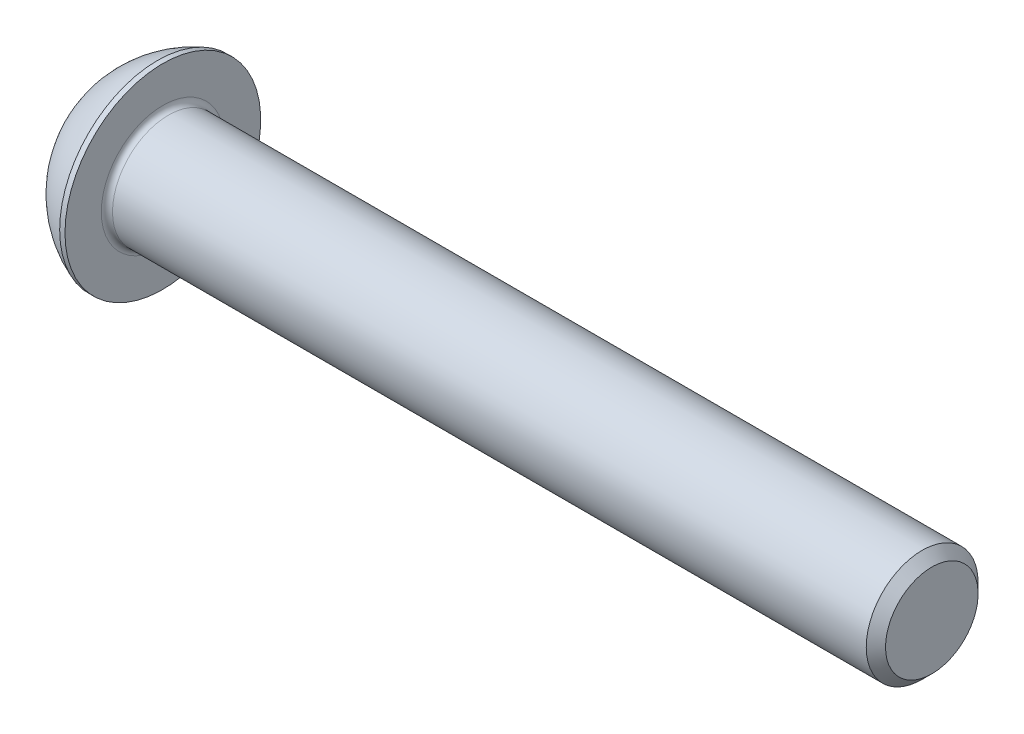
ISO-10303-21;
HEADER;
FILE_DESCRIPTION(('STEP AP214'),'2;1');
FILE_NAME('part.step','',(''),(''),'','','');
FILE_SCHEMA(('AUTOMOTIVE_DESIGN { 1 0 10303 214 1 1 1 1 }'));
ENDSEC;
DATA;
#1=APPLICATION_CONTEXT('core data for automotive mechanical design processes');
#2=APPLICATION_PROTOCOL_DEFINITION('international standard','automotive_design',2000,#1);
#3=PRODUCT_CONTEXT('',#1,'mechanical');
#4=PRODUCT('Part','Part','',(#3));
#5=PRODUCT_RELATED_PRODUCT_CATEGORY('part','',(#4));
#6=PRODUCT_DEFINITION_FORMATION('','',#4);
#7=PRODUCT_DEFINITION_CONTEXT('part definition',#1,'design');
#8=PRODUCT_DEFINITION('design','',#6,#7);
#9=PRODUCT_DEFINITION_SHAPE('','',#8);
#10=(LENGTH_UNIT() NAMED_UNIT(*) SI_UNIT(.MILLI.,.METRE.));
#11=(NAMED_UNIT(*) PLANE_ANGLE_UNIT() SI_UNIT($,.RADIAN.));
#12=(NAMED_UNIT(*) SI_UNIT($,.STERADIAN.) SOLID_ANGLE_UNIT());
#13=UNCERTAINTY_MEASURE_WITH_UNIT(LENGTH_MEASURE(1.E-05),#10,'distance_accuracy_value','');
#14=(GEOMETRIC_REPRESENTATION_CONTEXT(3) GLOBAL_UNCERTAINTY_ASSIGNED_CONTEXT((#13)) GLOBAL_UNIT_ASSIGNED_CONTEXT((#10,
#11,#12)) REPRESENTATION_CONTEXT('',''));
#15=CARTESIAN_POINT('',(0.,0.,0.));
#16=DIRECTION('',(0.,0.,1.));
#17=DIRECTION('',(1.,0.,0.));
#18=AXIS2_PLACEMENT_3D('',#15,#16,#17);
#19=CARTESIAN_POINT('',(0.,0.,0.));
#20=DIRECTION('',(-1.,0.,0.));
#21=DIRECTION('',(0.,0.,1.));
#22=AXIS2_PLACEMENT_3D('',#19,#20,#21);
#23=PLANE('',#22);
#24=CARTESIAN_POINT('',(0.,0.,0.));
#25=DIRECTION('',(-1.,0.,0.));
#26=DIRECTION('',(0.,0.,1.));
#27=AXIS2_PLACEMENT_3D('',#24,#25,#26);
#28=CIRCLE('',#27,3.5);
#29=CARTESIAN_POINT('',(0.,3.5,0.));
#30=VERTEX_POINT('',#29);
#31=EDGE_CURVE('E161',#30,#30,#28,.T.);
#32=ORIENTED_EDGE('',*,*,#31,.T.);
#33=EDGE_LOOP('',(#32));
#34=FACE_BOUND('',#33,.T.);
#35=DIRECTION('',(0.,-1.,0.));
#36=VECTOR('',#35,1.);
#37=CARTESIAN_POINT('',(0.,-1.44337567297406,2.5));
#38=LINE('',#37,#36);
#39=CARTESIAN_POINT('',(0.,1.44337567297406,2.5));
#40=VERTEX_POINT('',#39);
#41=CARTESIAN_POINT('',(0.,-1.44337567297406,2.5));
#42=VERTEX_POINT('',#41);
#43=EDGE_CURVE('E51',#40,#42,#38,.T.);
#44=ORIENTED_EDGE('',*,*,#43,.T.);
#45=DIRECTION('',(0.,-0.5,-0.866025403784439));
#46=VECTOR('',#45,1.);
#47=CARTESIAN_POINT('',(0.,-2.88675134594813,0.));
#48=LINE('',#47,#46);
#49=CARTESIAN_POINT('',(0.,-2.88675134594813,0.));
#50=VERTEX_POINT('',#49);
#51=EDGE_CURVE('E254',#42,#50,#48,.T.);
#52=ORIENTED_EDGE('',*,*,#51,.T.);
#53=DIRECTION('',(0.,0.5,-0.866025403784439));
#54=VECTOR('',#53,1.);
#55=CARTESIAN_POINT('',(0.,-1.44337567297406,-2.5));
#56=LINE('',#55,#54);
#57=CARTESIAN_POINT('',(0.,-1.44337567297406,-2.5));
#58=VERTEX_POINT('',#57);
#59=EDGE_CURVE('E136',#50,#58,#56,.T.);
#60=ORIENTED_EDGE('',*,*,#59,.T.);
#61=DIRECTION('',(0.,1.,0.));
#62=VECTOR('',#61,1.);
#63=CARTESIAN_POINT('',(0.,1.44337567297406,-2.5));
#64=LINE('',#63,#62);
#65=CARTESIAN_POINT('',(0.,1.44337567297406,-2.5));
#66=VERTEX_POINT('',#65);
#67=EDGE_CURVE('E257',#58,#66,#64,.T.);
#68=ORIENTED_EDGE('',*,*,#67,.T.);
#69=DIRECTION('',(0.,0.5,0.866025403784439));
#70=VECTOR('',#69,1.);
#71=CARTESIAN_POINT('',(0.,2.88675134594813,0.));
#72=LINE('',#71,#70);
#73=CARTESIAN_POINT('',(0.,2.88675134594813,0.));
#74=VERTEX_POINT('',#73);
#75=EDGE_CURVE('E259',#66,#74,#72,.T.);
#76=ORIENTED_EDGE('',*,*,#75,.T.);
#77=DIRECTION('',(0.,-0.5,0.866025403784439));
#78=VECTOR('',#77,1.);
#79=CARTESIAN_POINT('',(0.,1.44337567297406,2.5));
#80=LINE('',#79,#78);
#81=EDGE_CURVE('E261',#74,#40,#80,.T.);
#82=ORIENTED_EDGE('',*,*,#81,.T.);
#83=EDGE_LOOP('',(#44,#52,#60,#68,#76,#82));
#84=FACE_BOUND('',#83,.T.);
#85=ADVANCED_FACE('F36',(#34,#84),#23,.T.);
#86=CARTESIAN_POINT('',(6.58089552238806,0.,0.));
#87=DIRECTION('',(-1.,0.,0.));
#88=DIRECTION('',(0.,1.,0.));
#89=AXIS2_PLACEMENT_3D('',#86,#87,#88);
#90=SPHERICAL_SURFACE('',#89,7.45373637020972);
#91=CARTESIAN_POINT('',(4.02,0.,0.));
#92=DIRECTION('',(-1.,0.,0.));
#93=DIRECTION('',(0.,0.,1.));
#94=AXIS2_PLACEMENT_3D('',#91,#92,#93);
#95=CIRCLE('',#94,7.);
#96=CARTESIAN_POINT('',(4.02,7.,0.));
#97=VERTEX_POINT('',#96);
#98=EDGE_CURVE('E158',#97,#97,#95,.T.);
#99=CARTESIAN_POINT('',(4.02,7.,0.));
#100=CARTESIAN_POINT('',(3.96667727076465,6.98049242402172,0.));
#101=CARTESIAN_POINT('',(3.913577528648,6.96037534487455,0.));
#102=CARTESIAN_POINT('',(3.8078515532553,6.91893318326458,0.));
#103=CARTESIAN_POINT('',(3.75522531997925,6.89760810080177,0.));
#104=CARTESIAN_POINT('',(3.65047389687093,6.85376093558268,0.));
#105=CARTESIAN_POINT('',(3.59834870703866,6.83123885282639,0.));
#106=CARTESIAN_POINT('',(3.49462657751034,6.7850094841704,0.));
#107=CARTESIAN_POINT('',(3.44302963781429,6.7613021982707,0.));
#108=CARTESIAN_POINT('',(3.34039095714278,6.71271479411965,0.));
#109=CARTESIAN_POINT('',(3.28934921616733,6.6878346758683,0.));
#110=CARTESIAN_POINT('',(3.18784758682982,6.63691460241549,0.));
#111=CARTESIAN_POINT('',(3.13738769846775,6.61087464721403,0.));
#112=CARTESIAN_POINT('',(3.03707612567073,6.55764849769805,0.));
#113=CARTESIAN_POINT('',(2.98722444123577,6.53046230338352,0.));
#114=CARTESIAN_POINT('',(2.88815530965033,6.47495787293607,0.));
#115=CARTESIAN_POINT('',(2.83893786249984,6.44663963680314,0.));
#116=CARTESIAN_POINT('',(2.74116290772229,6.38888591095228,0.));
#117=CARTESIAN_POINT('',(2.69260540009523,6.35945042123436,0.));
#118=CARTESIAN_POINT('',(2.59617568194692,6.29947755995901,0.));
#119=CARTESIAN_POINT('',(2.54830347142567,6.2689401884016,0.));
#120=CARTESIAN_POINT('',(2.45326934720369,6.20677951059818,0.));
#121=CARTESIAN_POINT('',(2.40610743350296,6.17515620435217,0.));
#122=CARTESIAN_POINT('',(2.31251853170541,6.1108401714212,0.));
#123=CARTESIAN_POINT('',(2.2660915436086,6.07814744473625,0.));
#124=CARTESIAN_POINT('',(2.17399673801164,6.01170964364606,0.));
#125=CARTESIAN_POINT('',(2.12832892051151,5.97796456924083,0.));
#126=CARTESIAN_POINT('',(2.03777630464825,5.90943969498364,0.));
#127=CARTESIAN_POINT('',(1.99289150628513,5.87465989513168,0.));
#128=CARTESIAN_POINT('',(1.90392836832988,5.80408373260638,0.));
#129=CARTESIAN_POINT('',(1.85985002873775,5.76828736993305,0.));
#130=CARTESIAN_POINT('',(1.77252282681141,5.69569677525744,0.));
#131=CARTESIAN_POINT('',(1.72927396447721,5.65890254325517,0.));
#132=CARTESIAN_POINT('',(1.64362830238602,5.58433542451906,0.));
#133=CARTESIAN_POINT('',(1.60123150262904,5.54656253778523,0.));
#134=CARTESIAN_POINT('',(1.51731210604947,5.4700578352542,0.));
#135=CARTESIAN_POINT('',(1.47578950922687,5.431326019457,0.));
#136=CARTESIAN_POINT('',(1.39364020234904,5.35292368523707,0.));
#137=CARTESIAN_POINT('',(1.35301349229381,5.31325316681434,0.));
#138=CARTESIAN_POINT('',(1.27267717493576,5.23299414398831,0.));
#139=CARTESIAN_POINT('',(1.23296756763295,5.19240563958501,0.));
#140=CARTESIAN_POINT('',(1.15448619283766,5.1103318408312,0.));
#141=CARTESIAN_POINT('',(1.11571442534517,5.0688465464807,0.));
#142=CARTESIAN_POINT('',(1.03912897747163,4.98500083218559,0.));
#143=CARTESIAN_POINT('',(1.00131529709057,4.94264041224098,0.));
#144=CARTESIAN_POINT('',(0.926665770412102,4.85706656811615,0.));
#145=CARTESIAN_POINT('',(0.889829924114693,4.81385314393593,0.));
#146=CARTESIAN_POINT('',(0.817155301929323,4.72659585815459,0.));
#147=CARTESIAN_POINT('',(0.781316526041361,4.68255199655347,0.));
#148=CARTESIAN_POINT('',(0.710654760328621,4.59365683640532,0.));
#149=CARTESIAN_POINT('',(0.675831770503841,4.54880553785828,0.));
#150=CARTESIAN_POINT('',(0.607219762051194,4.45831892598402,0.));
#151=CARTESIAN_POINT('',(0.573430743423327,4.41268361265678,0.));
#152=CARTESIAN_POINT('',(0.506904322758881,4.32065280269138,0.));
#153=CARTESIAN_POINT('',(0.474166920722302,4.27425730605322,0.));
#154=CARTESIAN_POINT('',(0.409760828646038,4.18073035837463,0.));
#155=CARTESIAN_POINT('',(0.378092138606352,4.1335989073342,0.));
#156=CARTESIAN_POINT('',(0.31584001087466,4.03862466237799,0.));
#157=CARTESIAN_POINT('',(0.285256573182654,3.99078186846222,0.));
#158=CARTESIAN_POINT('',(0.2251909123934,3.89440992714022,0.));
#159=CARTESIAN_POINT('',(0.195708689296152,3.84588077973399,0.));
#160=CARTESIAN_POINT('',(0.137860887287448,3.74816145542334,0.));
#161=CARTESIAN_POINT('',(0.109495308375992,3.69897127851891,0.));
#162=CARTESIAN_POINT('',(0.0538954828937622,3.59995565329747,0.));
#163=CARTESIAN_POINT('',(0.0266612363229883,3.55013020498047,0.));
#164=CARTESIAN_POINT('',(0.,3.5,0.));
#165=B_SPLINE_CURVE_WITH_KNOTS('',3,(#99,#100,#101,#102,#103,#104,#105,#106,#107,#108,#109,#110,
#111,#112,#113,#114,#115,#116,#117,#118,#119,#120,#121,#122,#123,#124,#125,#126,#127,#128,#129,
#130,#131,#132,#133,#134,#135,#136,#137,#138,#139,#140,#141,#142,#143,#144,#145,#146,#147,#148,
#149,#150,#151,#152,#153,#154,#155,#156,#157,#158,#159,#160,#161,#162,#163,#164),.UNSPECIFIED.,
.F.,.F.,(4,2,2,2,2,2,2,2,2,2,2,2,2,2,2,2,2,2,2,2,2,2,2,2,2,2,2,2,2,2,2,2,4),(0.,
0.170333394580244,0.340666789160487,0.51100018374073,0.681333578320973,0.851666972901216,
1.02200036748146,1.1923337620617,1.36266715664194,1.53300055122219,1.70333394580243,
1.87366734038267,2.04400073496292,2.21433412954316,2.3846675241234,2.55500091870365,
2.72533431328389,2.89566770786413,3.06600110244437,3.23633449702462,3.40666789160486,
3.5770012861851,3.74733468076535,3.91766807534559,4.08800146992583,4.25833486450608,
4.42866825908632,4.59900165366656,4.76933504824681,4.93966844282705,5.11000183740729,
5.28033523198754,5.45066862656778),.UNSPECIFIED.);
#166=EDGE_CURVE('BSEAM182',#97,#30,#165,.T.);
#167=ORIENTED_EDGE('',*,*,#98,.T.);
#168=ORIENTED_EDGE('',*,*,#31,.F.);
#169=ORIENTED_EDGE('',*,*,#166,.T.);
#170=ORIENTED_EDGE('',*,*,#166,.F.);
#171=EDGE_LOOP('',(#167,#169,#168,#170));
#172=FACE_BOUND('',#171,.T.);
#173=ADVANCED_FACE('F182',(#172),#90,.T.);
#174=CARTESIAN_POINT('',(0.,0.,0.));
#175=DIRECTION('',(-1.,0.,0.));
#176=DIRECTION('',(0.,0.,1.));
#177=AXIS2_PLACEMENT_3D('',#174,#175,#176);
#178=CYLINDRICAL_SURFACE('',#177,7.);
#179=ORIENTED_EDGE('',*,*,#98,.F.);
#180=EDGE_LOOP('',(#179));
#181=FACE_BOUND('',#180,.T.);
#182=CARTESIAN_POINT('',(4.4,0.,0.));
#183=DIRECTION('',(-1.,0.,0.));
#184=DIRECTION('',(0.,0.,1.));
#185=AXIS2_PLACEMENT_3D('',#182,#183,#184);
#186=CIRCLE('',#185,7.);
#187=CARTESIAN_POINT('',(4.4,0.,7.));
#188=VERTEX_POINT('',#187);
#189=EDGE_CURVE('E155',#188,#188,#186,.T.);
#190=ORIENTED_EDGE('',*,*,#189,.T.);
#191=EDGE_LOOP('',(#190));
#192=FACE_BOUND('',#191,.T.);
#193=ADVANCED_FACE('F187',(#181,#192),#178,.T.);
#194=CARTESIAN_POINT('',(4.4,4.,0.));
#195=DIRECTION('',(-1.,0.,0.));
#196=DIRECTION('',(0.,0.,1.));
#197=AXIS2_PLACEMENT_3D('',#194,#195,#196);
#198=PLANE('',#197);
#199=CARTESIAN_POINT('',(4.4,0.,0.));
#200=DIRECTION('',(-1.,0.,0.));
#201=DIRECTION('',(0.,0.,1.));
#202=AXIS2_PLACEMENT_3D('',#199,#200,#201);
#203=CIRCLE('',#202,4.4);
#204=CARTESIAN_POINT('',(4.4,0.,4.4));
#205=VERTEX_POINT('',#204);
#206=EDGE_CURVE('E44',#205,#205,#203,.T.);
#207=ORIENTED_EDGE('',*,*,#206,.T.);
#208=EDGE_LOOP('',(#207));
#209=FACE_BOUND('',#208,.T.);
#210=ORIENTED_EDGE('',*,*,#189,.F.);
#211=EDGE_LOOP('',(#210));
#212=FACE_BOUND('',#211,.T.);
#213=ADVANCED_FACE('F166',(#209,#212),#198,.F.);
#214=CARTESIAN_POINT('',(0.,0.,0.));
#215=DIRECTION('',(-1.,0.,0.));
#216=DIRECTION('',(0.,0.,1.));
#217=AXIS2_PLACEMENT_3D('',#214,#215,#216);
#218=CYLINDRICAL_SURFACE('',#217,4.);
#219=CARTESIAN_POINT('',(4.8,0.,0.));
#220=DIRECTION('',(-1.,0.,0.));
#221=DIRECTION('',(0.,0.,1.));
#222=AXIS2_PLACEMENT_3D('',#219,#220,#221);
#223=CIRCLE('',#222,4.);
#224=CARTESIAN_POINT('',(4.8,0.,4.));
#225=VERTEX_POINT('',#224);
#226=EDGE_CURVE('E11',#225,#225,#223,.F.);
#227=ORIENTED_EDGE('',*,*,#226,.T.);
#228=EDGE_LOOP('',(#227));
#229=FACE_BOUND('',#228,.T.);
#230=CARTESIAN_POINT('',(58.7095,0.,0.));
#231=DIRECTION('',(-1.,0.,0.));
#232=DIRECTION('',(0.,0.,1.));
#233=AXIS2_PLACEMENT_3D('',#230,#231,#232);
#234=CIRCLE('',#233,4.);
#235=CARTESIAN_POINT('',(58.7095,0.,4.));
#236=VERTEX_POINT('',#235);
#237=EDGE_CURVE('E152',#236,#236,#234,.T.);
#238=ORIENTED_EDGE('',*,*,#237,.T.);
#239=EDGE_LOOP('',(#238));
#240=FACE_BOUND('',#239,.T.);
#241=ADVANCED_FACE('F196',(#229,#240),#218,.T.);
#242=CARTESIAN_POINT('',(59.4,0.,0.));
#243=DIRECTION('',(-1.,0.,0.));
#244=DIRECTION('',(0.,0.,1.));
#245=AXIS2_PLACEMENT_3D('',#242,#243,#244);
#246=CONICAL_SURFACE('',#245,3.3095,0.785398163397446);
#247=ORIENTED_EDGE('',*,*,#237,.F.);
#248=EDGE_LOOP('',(#247));
#249=FACE_BOUND('',#248,.T.);
#250=CARTESIAN_POINT('',(59.4,0.,0.));
#251=DIRECTION('',(-1.,0.,0.));
#252=DIRECTION('',(0.,0.,1.));
#253=AXIS2_PLACEMENT_3D('',#250,#251,#252);
#254=CIRCLE('',#253,3.3095);
#255=CARTESIAN_POINT('',(59.4,0.,3.3095));
#256=VERTEX_POINT('',#255);
#257=EDGE_CURVE('E148',#256,#256,#254,.T.);
#258=ORIENTED_EDGE('',*,*,#257,.T.);
#259=EDGE_LOOP('',(#258));
#260=FACE_BOUND('',#259,.T.);
#261=ADVANCED_FACE('F177',(#249,#260),#246,.T.);
#262=CARTESIAN_POINT('',(59.4,0.,0.));
#263=DIRECTION('',(-1.,0.,0.));
#264=DIRECTION('',(0.,0.,1.));
#265=AXIS2_PLACEMENT_3D('',#262,#263,#264);
#266=PLANE('',#265);
#267=ORIENTED_EDGE('',*,*,#257,.F.);
#268=EDGE_LOOP('',(#267));
#269=FACE_BOUND('',#268,.T.);
#270=ADVANCED_FACE('F170',(#269),#266,.F.);
#271=CARTESIAN_POINT('',(4.8,0.,0.));
#272=DIRECTION('',(-1.,0.,0.));
#273=DIRECTION('',(0.,0.,1.));
#274=AXIS2_PLACEMENT_3D('',#271,#272,#273);
#275=TOROIDAL_SURFACE('',#274,4.4,0.4);
#276=ORIENTED_EDGE('',*,*,#226,.F.);
#277=EDGE_LOOP('',(#276));
#278=FACE_BOUND('',#277,.T.);
#279=ORIENTED_EDGE('',*,*,#206,.F.);
#280=EDGE_LOOP('',(#279));
#281=FACE_BOUND('',#280,.T.);
#282=ADVANCED_FACE('F38',(#278,#281),#275,.F.);
#283=CARTESIAN_POINT('',(2.6,-2.88675134594813,0.));
#284=DIRECTION('',(0.,0.866025403784439,-0.5));
#285=DIRECTION('',(0.,0.5,0.866025403784439));
#286=AXIS2_PLACEMENT_3D('',#283,#284,#285);
#287=PLANE('',#286);
#288=DIRECTION('',(0.,-0.5,-0.866025403784439));
#289=VECTOR('',#288,1.);
#290=CARTESIAN_POINT('',(2.6,-2.88675134594813,0.));
#291=LINE('',#290,#289);
#292=CARTESIAN_POINT('',(2.6,-1.44337567297406,2.5));
#293=VERTEX_POINT('',#292);
#294=CARTESIAN_POINT('',(2.6,-2.1650635094611,1.25));
#295=VERTEX_POINT('',#294);
#296=EDGE_CURVE('E119',#293,#295,#291,.T.);
#297=ORIENTED_EDGE('',*,*,#296,.T.);
#298=CARTESIAN_POINT('',(2.6,-2.88675134594813,0.));
#299=VERTEX_POINT('',#298);
#300=EDGE_CURVE('E112',#295,#299,#291,.T.);
#301=ORIENTED_EDGE('',*,*,#300,.T.);
#302=DIRECTION('',(-1.,0.,0.));
#303=VECTOR('',#302,1.);
#304=CARTESIAN_POINT('',(2.6,-2.88675134594813,0.));
#305=LINE('',#304,#303);
#306=EDGE_CURVE('E116',#299,#50,#305,.T.);
#307=ORIENTED_EDGE('',*,*,#306,.T.);
#308=ORIENTED_EDGE('',*,*,#51,.F.);
#309=DIRECTION('',(-1.,0.,0.));
#310=VECTOR('',#309,1.);
#311=CARTESIAN_POINT('',(2.6,-1.44337567297406,2.5));
#312=LINE('',#311,#310);
#313=EDGE_CURVE('E244',#293,#42,#312,.T.);
#314=ORIENTED_EDGE('',*,*,#313,.F.);
#315=EDGE_LOOP('',(#297,#301,#307,#308,#314));
#316=FACE_BOUND('',#315,.T.);
#317=ADVANCED_FACE('F114',(#316),#287,.T.);
#318=CARTESIAN_POINT('',(2.6,-1.44337567297406,-2.5));
#319=DIRECTION('',(0.,0.866025403784439,0.5));
#320=DIRECTION('',(0.,-0.5,0.866025403784439));
#321=AXIS2_PLACEMENT_3D('',#318,#319,#320);
#322=PLANE('',#321);
#323=DIRECTION('',(0.,0.5,-0.866025403784439));
#324=VECTOR('',#323,1.);
#325=CARTESIAN_POINT('',(2.6,-1.44337567297406,-2.5));
#326=LINE('',#325,#324);
#327=CARTESIAN_POINT('',(2.6,-2.1650635094611,-1.25));
#328=VERTEX_POINT('',#327);
#329=EDGE_CURVE('E124',#299,#328,#326,.T.);
#330=ORIENTED_EDGE('',*,*,#329,.T.);
#331=CARTESIAN_POINT('',(2.6,-1.44337567297406,-2.5));
#332=VERTEX_POINT('',#331);
#333=EDGE_CURVE('E131',#328,#332,#326,.T.);
#334=ORIENTED_EDGE('',*,*,#333,.T.);
#335=DIRECTION('',(-1.,0.,0.));
#336=VECTOR('',#335,1.);
#337=CARTESIAN_POINT('',(2.6,-1.44337567297406,-2.5));
#338=LINE('',#337,#336);
#339=EDGE_CURVE('E138',#332,#58,#338,.T.);
#340=ORIENTED_EDGE('',*,*,#339,.T.);
#341=ORIENTED_EDGE('',*,*,#59,.F.);
#342=ORIENTED_EDGE('',*,*,#306,.F.);
#343=EDGE_LOOP('',(#330,#334,#340,#341,#342));
#344=FACE_BOUND('',#343,.T.);
#345=ADVANCED_FACE('F134',(#344),#322,.T.);
#346=CARTESIAN_POINT('',(2.6,1.44337567297406,-2.5));
#347=DIRECTION('',(0.,0.,1.));
#348=DIRECTION('',(0.,-1.,0.));
#349=AXIS2_PLACEMENT_3D('',#346,#347,#348);
#350=PLANE('',#349);
#351=DIRECTION('',(0.,1.,0.));
#352=VECTOR('',#351,1.);
#353=CARTESIAN_POINT('',(2.6,1.44337567297406,-2.5));
#354=LINE('',#353,#352);
#355=CARTESIAN_POINT('',(2.6,0.,-2.5));
#356=VERTEX_POINT('',#355);
#357=EDGE_CURVE('E280',#332,#356,#354,.T.);
#358=ORIENTED_EDGE('',*,*,#357,.T.);
#359=CARTESIAN_POINT('',(2.6,1.44337567297406,-2.5));
#360=VERTEX_POINT('',#359);
#361=EDGE_CURVE('E130',#356,#360,#354,.T.);
#362=ORIENTED_EDGE('',*,*,#361,.T.);
#363=DIRECTION('',(-1.,0.,0.));
#364=VECTOR('',#363,1.);
#365=CARTESIAN_POINT('',(2.6,1.44337567297406,-2.5));
#366=LINE('',#365,#364);
#367=EDGE_CURVE('E143',#360,#66,#366,.T.);
#368=ORIENTED_EDGE('',*,*,#367,.T.);
#369=ORIENTED_EDGE('',*,*,#67,.F.);
#370=ORIENTED_EDGE('',*,*,#339,.F.);
#371=EDGE_LOOP('',(#358,#362,#368,#369,#370));
#372=FACE_BOUND('',#371,.T.);
#373=ADVANCED_FACE('F210',(#372),#350,.T.);
#374=CARTESIAN_POINT('',(2.6,2.88675134594813,0.));
#375=DIRECTION('',(0.,-0.866025403784439,0.5));
#376=DIRECTION('',(0.,-0.5,-0.866025403784439));
#377=AXIS2_PLACEMENT_3D('',#374,#375,#376);
#378=PLANE('',#377);
#379=DIRECTION('',(0.,0.5,0.866025403784439));
#380=VECTOR('',#379,1.);
#381=CARTESIAN_POINT('',(2.6,2.88675134594813,0.));
#382=LINE('',#381,#380);
#383=CARTESIAN_POINT('',(2.6,2.1650635094611,-1.25));
#384=VERTEX_POINT('',#383);
#385=EDGE_CURVE('E286',#360,#384,#382,.T.);
#386=ORIENTED_EDGE('',*,*,#385,.T.);
#387=CARTESIAN_POINT('',(2.6,2.88675134594813,0.));
#388=VERTEX_POINT('',#387);
#389=EDGE_CURVE('E284',#384,#388,#382,.T.);
#390=ORIENTED_EDGE('',*,*,#389,.T.);
#391=DIRECTION('',(-1.,0.,0.));
#392=VECTOR('',#391,1.);
#393=CARTESIAN_POINT('',(2.6,2.88675134594813,0.));
#394=LINE('',#393,#392);
#395=EDGE_CURVE('E266',#388,#74,#394,.T.);
#396=ORIENTED_EDGE('',*,*,#395,.T.);
#397=ORIENTED_EDGE('',*,*,#75,.F.);
#398=ORIENTED_EDGE('',*,*,#367,.F.);
#399=EDGE_LOOP('',(#386,#390,#396,#397,#398));
#400=FACE_BOUND('',#399,.T.);
#401=ADVANCED_FACE('F213',(#400),#378,.T.);
#402=CARTESIAN_POINT('',(2.6,1.44337567297406,2.5));
#403=DIRECTION('',(0.,-0.866025403784439,-0.5));
#404=DIRECTION('',(0.,0.5,-0.866025403784439));
#405=AXIS2_PLACEMENT_3D('',#402,#403,#404);
#406=PLANE('',#405);
#407=DIRECTION('',(0.,-0.5,0.866025403784439));
#408=VECTOR('',#407,1.);
#409=CARTESIAN_POINT('',(2.6,1.44337567297406,2.5));
#410=LINE('',#409,#408);
#411=CARTESIAN_POINT('',(2.6,2.1650635094611,1.25));
#412=VERTEX_POINT('',#411);
#413=EDGE_CURVE('E250',#388,#412,#410,.T.);
#414=ORIENTED_EDGE('',*,*,#413,.T.);
#415=CARTESIAN_POINT('',(2.6,1.44337567297406,2.5));
#416=VERTEX_POINT('',#415);
#417=EDGE_CURVE('E242',#412,#416,#410,.T.);
#418=ORIENTED_EDGE('',*,*,#417,.T.);
#419=DIRECTION('',(-1.,0.,0.));
#420=VECTOR('',#419,1.);
#421=CARTESIAN_POINT('',(2.6,1.44337567297406,2.5));
#422=LINE('',#421,#420);
#423=EDGE_CURVE('E248',#416,#40,#422,.T.);
#424=ORIENTED_EDGE('',*,*,#423,.T.);
#425=ORIENTED_EDGE('',*,*,#81,.F.);
#426=ORIENTED_EDGE('',*,*,#395,.F.);
#427=EDGE_LOOP('',(#414,#418,#424,#425,#426));
#428=FACE_BOUND('',#427,.T.);
#429=ADVANCED_FACE('F217',(#428),#406,.T.);
#430=CARTESIAN_POINT('',(2.6,-1.44337567297406,2.5));
#431=DIRECTION('',(0.,0.,-1.));
#432=DIRECTION('',(-1.,0.,0.));
#433=AXIS2_PLACEMENT_3D('',#430,#431,#432);
#434=PLANE('',#433);
#435=DIRECTION('',(0.,-1.,0.));
#436=VECTOR('',#435,1.);
#437=CARTESIAN_POINT('',(2.6,-1.44337567297406,2.5));
#438=LINE('',#437,#436);
#439=CARTESIAN_POINT('',(2.6,0.,2.5));
#440=VERTEX_POINT('',#439);
#441=EDGE_CURVE('E59',#416,#440,#438,.T.);
#442=ORIENTED_EDGE('',*,*,#441,.T.);
#443=EDGE_CURVE('E245',#440,#293,#438,.T.);
#444=ORIENTED_EDGE('',*,*,#443,.T.);
#445=ORIENTED_EDGE('',*,*,#313,.T.);
#446=ORIENTED_EDGE('',*,*,#43,.F.);
#447=ORIENTED_EDGE('',*,*,#423,.F.);
#448=EDGE_LOOP('',(#442,#444,#445,#446,#447));
#449=FACE_BOUND('',#448,.T.);
#450=ADVANCED_FACE('F221',(#449),#434,.T.);
#451=CARTESIAN_POINT('',(2.6,0.,5.));
#452=DIRECTION('',(-1.,0.,0.));
#453=DIRECTION('',(0.,0.,1.));
#454=AXIS2_PLACEMENT_3D('',#451,#452,#453);
#455=PLANE('',#454);
#456=ORIENTED_EDGE('',*,*,#441,.F.);
#457=ORIENTED_EDGE('',*,*,#417,.F.);
#458=CARTESIAN_POINT('',(2.6,0.,0.));
#459=DIRECTION('',(-1.,0.,0.));
#460=DIRECTION('',(0.,0.,1.));
#461=AXIS2_PLACEMENT_3D('',#458,#459,#460);
#462=CIRCLE('',#461,2.5);
#463=EDGE_CURVE('E142',#440,#412,#462,.T.);
#464=ORIENTED_EDGE('',*,*,#463,.F.);
#465=EDGE_LOOP('',(#456,#457,#464));
#466=FACE_BOUND('',#465,.T.);
#467=ADVANCED_FACE('F225',(#466),#455,.T.);
#468=ORIENTED_EDGE('',*,*,#413,.F.);
#469=ORIENTED_EDGE('',*,*,#389,.F.);
#470=EDGE_CURVE('E149',#412,#384,#462,.T.);
#471=ORIENTED_EDGE('',*,*,#470,.F.);
#472=EDGE_LOOP('',(#468,#469,#471));
#473=FACE_BOUND('',#472,.T.);
#474=ADVANCED_FACE('F233',(#473),#455,.T.);
#475=ORIENTED_EDGE('',*,*,#385,.F.);
#476=ORIENTED_EDGE('',*,*,#361,.F.);
#477=EDGE_CURVE('E291',#384,#356,#462,.T.);
#478=ORIENTED_EDGE('',*,*,#477,.F.);
#479=EDGE_LOOP('',(#475,#476,#478));
#480=FACE_BOUND('',#479,.T.);
#481=ADVANCED_FACE('F238',(#480),#455,.T.);
#482=ORIENTED_EDGE('',*,*,#357,.F.);
#483=ORIENTED_EDGE('',*,*,#333,.F.);
#484=EDGE_CURVE('E283',#356,#328,#462,.T.);
#485=ORIENTED_EDGE('',*,*,#484,.F.);
#486=EDGE_LOOP('',(#482,#483,#485));
#487=FACE_BOUND('',#486,.T.);
#488=ADVANCED_FACE('F231',(#487),#455,.T.);
#489=ORIENTED_EDGE('',*,*,#329,.F.);
#490=ORIENTED_EDGE('',*,*,#300,.F.);
#491=EDGE_CURVE('E126',#328,#295,#462,.T.);
#492=ORIENTED_EDGE('',*,*,#491,.F.);
#493=EDGE_LOOP('',(#489,#490,#492));
#494=FACE_BOUND('',#493,.T.);
#495=ADVANCED_FACE('F125',(#494),#455,.T.);
#496=ORIENTED_EDGE('',*,*,#296,.F.);
#497=ORIENTED_EDGE('',*,*,#443,.F.);
#498=EDGE_CURVE('E137',#295,#440,#462,.T.);
#499=ORIENTED_EDGE('',*,*,#498,.F.);
#500=EDGE_LOOP('',(#496,#497,#499));
#501=FACE_BOUND('',#500,.T.);
#502=ADVANCED_FACE('F205',(#501),#455,.T.);
#503=CARTESIAN_POINT('',(4.04337567297408,0.,0.));
#504=DIRECTION('',(-1.,0.,0.));
#505=DIRECTION('',(0.,0.,1.));
#506=AXIS2_PLACEMENT_3D('',#503,#504,#505);
#507=CONICAL_SURFACE('',#506,0.,1.04719755119659);
#508=ORIENTED_EDGE('',*,*,#463,.T.);
#509=ORIENTED_EDGE('',*,*,#470,.T.);
#510=ORIENTED_EDGE('',*,*,#477,.T.);
#511=ORIENTED_EDGE('',*,*,#484,.T.);
#512=ORIENTED_EDGE('',*,*,#491,.T.);
#513=ORIENTED_EDGE('',*,*,#498,.T.);
#514=EDGE_LOOP('',(#508,#509,#510,#511,#512,#513));
#515=FACE_BOUND('',#514,.T.);
#516=CARTESIAN_POINT('',(4.04337567297408,0.,0.));
#517=VERTEX_POINT('',#516);
#518=VERTEX_LOOP('',#517);
#519=FACE_BOUND('',#518,.T.);
#520=ADVANCED_FACE('F203',(#515,#519),#507,.F.);
#521=CLOSED_SHELL('',(#85,#173,#193,#213,#241,#261,#270,#282,#317,#345,#373,#401,#429,#450,#467,
#474,#481,#488,#495,#502,#520));
#522=MANIFOLD_SOLID_BREP('B2',#521);
#523=ADVANCED_BREP_SHAPE_REPRESENTATION('',(#18,#522),#14);
#524=SHAPE_DEFINITION_REPRESENTATION(#9,#523);
ENDSEC;
END-ISO-10303-21;
